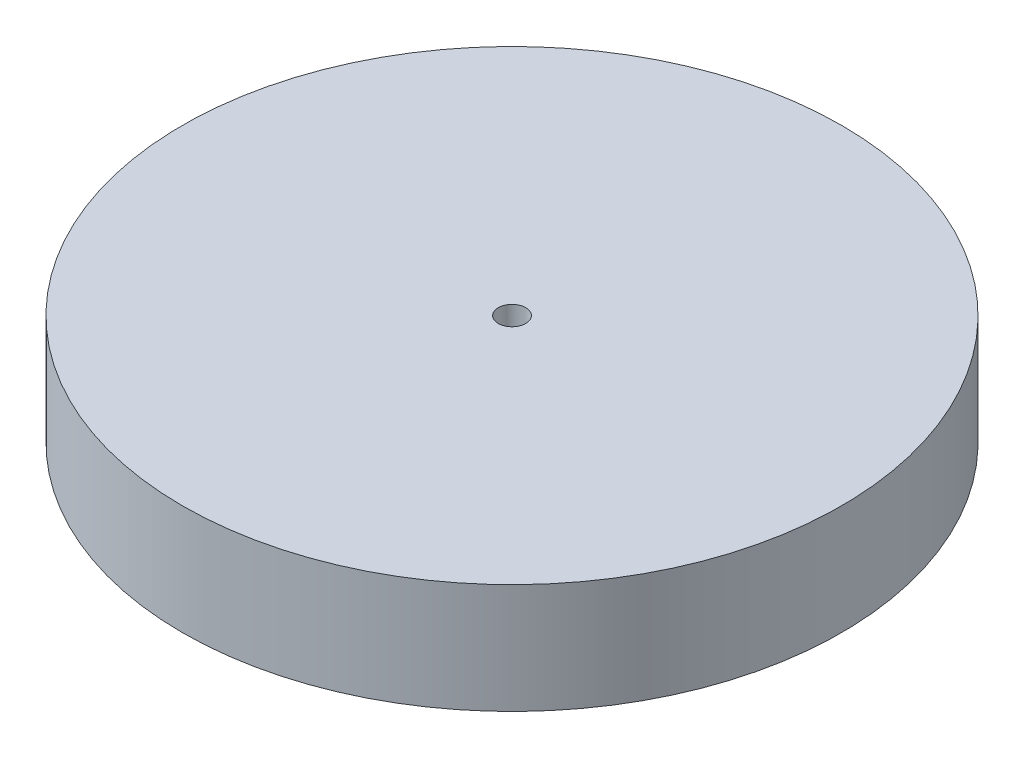
ISO-10303-21;
HEADER;
FILE_DESCRIPTION(('STEP AP214'),'2;1');
FILE_NAME('part.step','',(''),(''),'','','');
FILE_SCHEMA(('AUTOMOTIVE_DESIGN { 1 0 10303 214 1 1 1 1 }'));
ENDSEC;
DATA;
#1=APPLICATION_CONTEXT('core data for automotive mechanical design processes');
#2=APPLICATION_PROTOCOL_DEFINITION('international standard','automotive_design',2000,#1);
#3=PRODUCT_CONTEXT('',#1,'mechanical');
#4=PRODUCT('Part','Part','',(#3));
#5=PRODUCT_RELATED_PRODUCT_CATEGORY('part','',(#4));
#6=PRODUCT_DEFINITION_FORMATION('','',#4);
#7=PRODUCT_DEFINITION_CONTEXT('part definition',#1,'design');
#8=PRODUCT_DEFINITION('design','',#6,#7);
#9=PRODUCT_DEFINITION_SHAPE('','',#8);
#10=(LENGTH_UNIT() NAMED_UNIT(*) SI_UNIT(.MILLI.,.METRE.));
#11=(NAMED_UNIT(*) PLANE_ANGLE_UNIT() SI_UNIT($,.RADIAN.));
#12=(NAMED_UNIT(*) SI_UNIT($,.STERADIAN.) SOLID_ANGLE_UNIT());
#13=UNCERTAINTY_MEASURE_WITH_UNIT(LENGTH_MEASURE(1.E-05),#10,'distance_accuracy_value','');
#14=(GEOMETRIC_REPRESENTATION_CONTEXT(3) GLOBAL_UNCERTAINTY_ASSIGNED_CONTEXT((#13)) GLOBAL_UNIT_ASSIGNED_CONTEXT((#10,
#11,#12)) REPRESENTATION_CONTEXT('',''));
#15=CARTESIAN_POINT('',(0.,0.,0.));
#16=DIRECTION('',(0.,0.,1.));
#17=DIRECTION('',(1.,0.,0.));
#18=AXIS2_PLACEMENT_3D('',#15,#16,#17);
#19=CARTESIAN_POINT('',(0.,50.8,0.));
#20=DIRECTION('',(0.,1.,0.));
#21=DIRECTION('',(0.,0.,1.));
#22=AXIS2_PLACEMENT_3D('',#19,#20,#21);
#23=PLANE('',#22);
#24=CARTESIAN_POINT('',(0.,50.8,0.));
#25=DIRECTION('',(0.,1.,0.));
#26=DIRECTION('',(0.,0.,1.));
#27=AXIS2_PLACEMENT_3D('',#24,#25,#26);
#28=CIRCLE('',#27,152.4);
#29=CARTESIAN_POINT('',(0.,50.8,152.4));
#30=VERTEX_POINT('',#29);
#31=EDGE_CURVE('E10',#30,#30,#28,.T.);
#32=ORIENTED_EDGE('',*,*,#31,.T.);
#33=EDGE_LOOP('',(#32));
#34=FACE_BOUND('',#33,.T.);
#35=CARTESIAN_POINT('',(0.,50.8,0.));
#36=DIRECTION('',(0.,1.,0.));
#37=DIRECTION('',(0.,0.,1.));
#38=AXIS2_PLACEMENT_3D('',#35,#36,#37);
#39=CIRCLE('',#38,6.35);
#40=CARTESIAN_POINT('',(0.,50.8,6.35));
#41=VERTEX_POINT('',#40);
#42=EDGE_CURVE('E42',#41,#41,#39,.T.);
#43=ORIENTED_EDGE('',*,*,#42,.F.);
#44=EDGE_LOOP('',(#43));
#45=FACE_BOUND('',#44,.T.);
#46=ADVANCED_FACE('F31',(#34,#45),#23,.T.);
#47=CARTESIAN_POINT('',(0.,0.,0.));
#48=DIRECTION('',(0.,1.,0.));
#49=DIRECTION('',(0.,0.,1.));
#50=AXIS2_PLACEMENT_3D('',#47,#48,#49);
#51=PLANE('',#50);
#52=CARTESIAN_POINT('',(0.,0.,0.));
#53=DIRECTION('',(0.,1.,0.));
#54=DIRECTION('',(0.,0.,1.));
#55=AXIS2_PLACEMENT_3D('',#52,#53,#54);
#56=CIRCLE('',#55,152.4);
#57=CARTESIAN_POINT('',(0.,0.,152.4));
#58=VERTEX_POINT('',#57);
#59=EDGE_CURVE('E35',#58,#58,#56,.T.);
#60=ORIENTED_EDGE('',*,*,#59,.F.);
#61=EDGE_LOOP('',(#60));
#62=FACE_BOUND('',#61,.T.);
#63=CARTESIAN_POINT('',(0.,0.,0.));
#64=DIRECTION('',(0.,1.,0.));
#65=DIRECTION('',(0.,0.,1.));
#66=AXIS2_PLACEMENT_3D('',#63,#64,#65);
#67=CIRCLE('',#66,6.35);
#68=CARTESIAN_POINT('',(0.,0.,6.35));
#69=VERTEX_POINT('',#68);
#70=EDGE_CURVE('E44',#69,#69,#67,.T.);
#71=ORIENTED_EDGE('',*,*,#70,.T.);
#72=EDGE_LOOP('',(#71));
#73=FACE_BOUND('',#72,.T.);
#74=ADVANCED_FACE('F54',(#62,#73),#51,.F.);
#75=CARTESIAN_POINT('',(0.,50.8,0.));
#76=DIRECTION('',(0.,-1.,0.));
#77=DIRECTION('',(0.,0.,-1.));
#78=AXIS2_PLACEMENT_3D('',#75,#76,#77);
#79=CYLINDRICAL_SURFACE('',#78,152.4);
#80=ORIENTED_EDGE('',*,*,#31,.F.);
#81=EDGE_LOOP('',(#80));
#82=FACE_BOUND('',#81,.T.);
#83=ORIENTED_EDGE('',*,*,#59,.T.);
#84=EDGE_LOOP('',(#83));
#85=FACE_BOUND('',#84,.T.);
#86=ADVANCED_FACE('F33',(#82,#85),#79,.T.);
#87=CARTESIAN_POINT('',(0.,50.8,0.));
#88=DIRECTION('',(0.,-1.,0.));
#89=DIRECTION('',(0.,0.,-1.));
#90=AXIS2_PLACEMENT_3D('',#87,#88,#89);
#91=CYLINDRICAL_SURFACE('',#90,6.35);
#92=ORIENTED_EDGE('',*,*,#42,.T.);
#93=EDGE_LOOP('',(#92));
#94=FACE_BOUND('',#93,.T.);
#95=ORIENTED_EDGE('',*,*,#70,.F.);
#96=EDGE_LOOP('',(#95));
#97=FACE_BOUND('',#96,.T.);
#98=ADVANCED_FACE('F50',(#94,#97),#91,.F.);
#99=CLOSED_SHELL('',(#46,#74,#86,#98));
#100=MANIFOLD_SOLID_BREP('B2',#99);
#101=ADVANCED_BREP_SHAPE_REPRESENTATION('',(#18,#100),#14);
#102=SHAPE_DEFINITION_REPRESENTATION(#9,#101);
ENDSEC;
END-ISO-10303-21;
